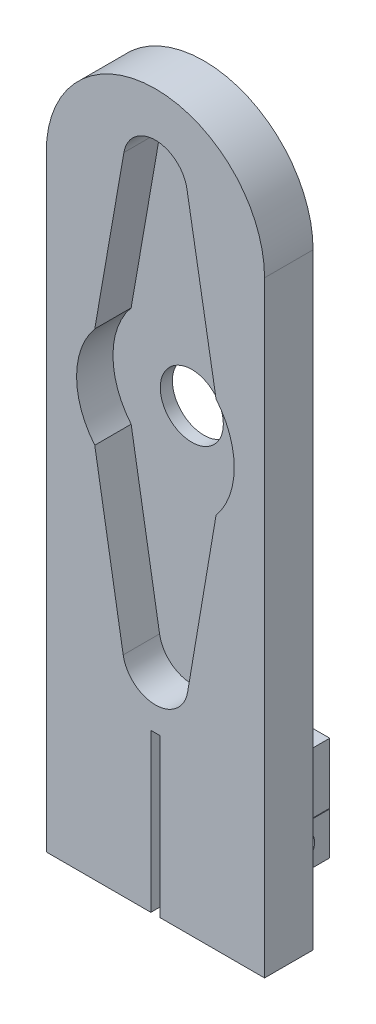
ISO-10303-21;
HEADER;
FILE_DESCRIPTION(('STEP AP214'),'2;1');
FILE_NAME('part.step','',(''),(''),'','','');
FILE_SCHEMA(('AUTOMOTIVE_DESIGN { 1 0 10303 214 1 1 1 1 }'));
ENDSEC;
DATA;
#1=APPLICATION_CONTEXT('core data for automotive mechanical design processes');
#2=APPLICATION_PROTOCOL_DEFINITION('international standard','automotive_design',2000,#1);
#3=PRODUCT_CONTEXT('',#1,'mechanical');
#4=PRODUCT('Part','Part','',(#3));
#5=PRODUCT_RELATED_PRODUCT_CATEGORY('part','',(#4));
#6=PRODUCT_DEFINITION_FORMATION('','',#4);
#7=PRODUCT_DEFINITION_CONTEXT('part definition',#1,'design');
#8=PRODUCT_DEFINITION('design','',#6,#7);
#9=PRODUCT_DEFINITION_SHAPE('','',#8);
#10=(LENGTH_UNIT() NAMED_UNIT(*) SI_UNIT(.MILLI.,.METRE.));
#11=(NAMED_UNIT(*) PLANE_ANGLE_UNIT() SI_UNIT($,.RADIAN.));
#12=(NAMED_UNIT(*) SI_UNIT($,.STERADIAN.) SOLID_ANGLE_UNIT());
#13=UNCERTAINTY_MEASURE_WITH_UNIT(LENGTH_MEASURE(1.E-05),#10,'distance_accuracy_value','');
#14=(GEOMETRIC_REPRESENTATION_CONTEXT(3) GLOBAL_UNCERTAINTY_ASSIGNED_CONTEXT((#13)) GLOBAL_UNIT_ASSIGNED_CONTEXT((#10,
#11,#12)) REPRESENTATION_CONTEXT('',''));
#15=CARTESIAN_POINT('',(0.,0.,0.));
#16=DIRECTION('',(0.,0.,1.));
#17=DIRECTION('',(1.,0.,0.));
#18=AXIS2_PLACEMENT_3D('',#15,#16,#17);
#19=CARTESIAN_POINT('',(0.,50.,0.));
#20=DIRECTION('',(0.,0.,-1.));
#21=DIRECTION('',(-1.,0.,0.));
#22=AXIS2_PLACEMENT_3D('',#19,#20,#21);
#23=PLANE('',#22);
#24=CARTESIAN_POINT('',(0.,34.8563142161993,0.));
#25=DIRECTION('',(0.,0.,-1.));
#26=DIRECTION('',(-1.,0.,0.));
#27=AXIS2_PLACEMENT_3D('',#24,#25,#26);
#28=CIRCLE('',#27,2.6);
#29=CARTESIAN_POINT('',(-2.6,34.8563142161993,0.));
#30=VERTEX_POINT('',#29);
#31=EDGE_CURVE('E335',#30,#30,#28,.F.);
#32=ORIENTED_EDGE('',*,*,#31,.T.);
#33=EDGE_LOOP('',(#32));
#34=FACE_BOUND('',#33,.T.);
#35=DIRECTION('',(0.,1.,0.));
#36=VECTOR('',#35,1.);
#37=CARTESIAN_POINT('',(0.375,0.,0.));
#38=LINE('',#37,#36);
#39=CARTESIAN_POINT('',(0.375,0.,0.));
#40=VERTEX_POINT('',#39);
#41=CARTESIAN_POINT('',(0.375,2.2621640661949,0.));
#42=VERTEX_POINT('',#41);
#43=EDGE_CURVE('E310',#40,#42,#38,.T.);
#44=ORIENTED_EDGE('',*,*,#43,.T.);
#45=DIRECTION('',(-1.,0.,0.));
#46=VECTOR('',#45,1.);
#47=CARTESIAN_POINT('',(5.375,2.2621640661949,0.));
#48=LINE('',#47,#46);
#49=CARTESIAN_POINT('',(5.375,2.2621640661949,0.));
#50=VERTEX_POINT('',#49);
#51=EDGE_CURVE('E59',#50,#42,#48,.T.);
#52=ORIENTED_EDGE('',*,*,#51,.F.);
#53=DIRECTION('',(0.,-1.,0.));
#54=VECTOR('',#53,1.);
#55=CARTESIAN_POINT('',(5.375,5.7621640661949,0.));
#56=LINE('',#55,#54);
#57=CARTESIAN_POINT('',(5.375,5.7621640661949,0.));
#58=VERTEX_POINT('',#57);
#59=EDGE_CURVE('E64',#58,#50,#56,.T.);
#60=ORIENTED_EDGE('',*,*,#59,.F.);
#61=DIRECTION('',(-1.,0.,0.));
#62=VECTOR('',#61,1.);
#63=CARTESIAN_POINT('',(5.375,5.7621640661949,0.));
#64=LINE('',#63,#62);
#65=CARTESIAN_POINT('',(0.375,5.7621640661949,0.));
#66=VERTEX_POINT('',#65);
#67=EDGE_CURVE('E230',#58,#66,#64,.T.);
#68=ORIENTED_EDGE('',*,*,#67,.T.);
#69=CARTESIAN_POINT('',(0.375,5.81216406619489,0.));
#70=VERTEX_POINT('',#69);
#71=EDGE_CURVE('E314',#66,#70,#38,.T.);
#72=ORIENTED_EDGE('',*,*,#71,.T.);
#73=DIRECTION('',(1.,0.,0.));
#74=VECTOR('',#73,1.);
#75=CARTESIAN_POINT('',(5.375,5.8121640661949,0.));
#76=LINE('',#75,#74);
#77=CARTESIAN_POINT('',(5.375,5.8121640661949,0.));
#78=VERTEX_POINT('',#77);
#79=EDGE_CURVE('E260',#70,#78,#76,.T.);
#80=ORIENTED_EDGE('',*,*,#79,.T.);
#81=DIRECTION('',(0.,1.,0.));
#82=VECTOR('',#81,1.);
#83=CARTESIAN_POINT('',(5.375,10.8121640661949,0.));
#84=LINE('',#83,#82);
#85=CARTESIAN_POINT('',(5.375,10.8121640661949,0.));
#86=VERTEX_POINT('',#85);
#87=EDGE_CURVE('E254',#78,#86,#84,.T.);
#88=ORIENTED_EDGE('',*,*,#87,.T.);
#89=DIRECTION('',(-1.,0.,0.));
#90=VECTOR('',#89,1.);
#91=CARTESIAN_POINT('',(5.375,10.8121640661949,0.));
#92=LINE('',#91,#90);
#93=CARTESIAN_POINT('',(0.375,10.8121640661949,0.));
#94=VERTEX_POINT('',#93);
#95=EDGE_CURVE('E276',#86,#94,#92,.T.);
#96=ORIENTED_EDGE('',*,*,#95,.T.);
#97=CARTESIAN_POINT('',(0.375,13.,0.));
#98=VERTEX_POINT('',#97);
#99=EDGE_CURVE('E287',#94,#98,#38,.T.);
#100=ORIENTED_EDGE('',*,*,#99,.T.);
#101=DIRECTION('',(1.,0.,0.));
#102=VECTOR('',#101,1.);
#103=CARTESIAN_POINT('',(-0.375,13.,0.));
#104=LINE('',#103,#102);
#105=CARTESIAN_POINT('',(-0.375,13.,0.));
#106=VERTEX_POINT('',#105);
#107=EDGE_CURVE('E313',#106,#98,#104,.T.);
#108=ORIENTED_EDGE('',*,*,#107,.F.);
#109=DIRECTION('',(0.,1.,0.));
#110=VECTOR('',#109,1.);
#111=CARTESIAN_POINT('',(-0.375,0.,0.));
#112=LINE('',#111,#110);
#113=CARTESIAN_POINT('',(-0.375,0.,0.));
#114=VERTEX_POINT('',#113);
#115=EDGE_CURVE('E301',#114,#106,#112,.T.);
#116=ORIENTED_EDGE('',*,*,#115,.F.);
#117=DIRECTION('',(1.,0.,0.));
#118=VECTOR('',#117,1.);
#119=CARTESIAN_POINT('',(-9.,0.,0.));
#120=LINE('',#119,#118);
#121=CARTESIAN_POINT('',(-9.,0.,0.));
#122=VERTEX_POINT('',#121);
#123=EDGE_CURVE('E443',#122,#114,#120,.T.);
#124=ORIENTED_EDGE('',*,*,#123,.F.);
#125=DIRECTION('',(0.,1.,0.));
#126=VECTOR('',#125,1.);
#127=CARTESIAN_POINT('',(-9.,0.,0.));
#128=LINE('',#127,#126);
#129=CARTESIAN_POINT('',(-8.99999999999999,50.,0.));
#130=VERTEX_POINT('',#129);
#131=EDGE_CURVE('E455',#122,#130,#128,.T.);
#132=ORIENTED_EDGE('',*,*,#131,.T.);
#133=CARTESIAN_POINT('',(0.,50.,0.));
#134=DIRECTION('',(0.,0.,-1.));
#135=DIRECTION('',(-1.,0.,0.));
#136=AXIS2_PLACEMENT_3D('',#133,#134,#135);
#137=CIRCLE('',#136,8.99999999999999);
#138=CARTESIAN_POINT('',(8.99999999999999,50.,0.));
#139=VERTEX_POINT('',#138);
#140=EDGE_CURVE('E451',#130,#139,#137,.T.);
#141=ORIENTED_EDGE('',*,*,#140,.T.);
#142=DIRECTION('',(0.,1.,0.));
#143=VECTOR('',#142,1.);
#144=CARTESIAN_POINT('',(9.,0.,0.));
#145=LINE('',#144,#143);
#146=CARTESIAN_POINT('',(9.,0.,0.));
#147=VERTEX_POINT('',#146);
#148=EDGE_CURVE('E447',#147,#139,#145,.T.);
#149=ORIENTED_EDGE('',*,*,#148,.F.);
#150=EDGE_CURVE('E404',#40,#147,#120,.T.);
#151=ORIENTED_EDGE('',*,*,#150,.F.);
#152=EDGE_LOOP('',(#44,#52,#60,#68,#72,#80,#88,#96,#100,#108,#116,#124,#132,#141,#149,#151));
#153=FACE_BOUND('',#152,.T.);
#154=ADVANCED_FACE('F41',(#34,#153),#23,.T.);
#155=CARTESIAN_POINT('',(-9.,0.,4.));
#156=DIRECTION('',(0.,1.,0.));
#157=DIRECTION('',(0.,0.,1.));
#158=AXIS2_PLACEMENT_3D('',#155,#156,#157);
#159=PLANE('',#158);
#160=DIRECTION('',(0.,0.,-1.));
#161=VECTOR('',#160,1.);
#162=CARTESIAN_POINT('',(0.375,0.,4.));
#163=LINE('',#162,#161);
#164=CARTESIAN_POINT('',(0.375,0.,4.));
#165=VERTEX_POINT('',#164);
#166=EDGE_CURVE('E330',#165,#40,#163,.T.);
#167=ORIENTED_EDGE('',*,*,#166,.T.);
#168=ORIENTED_EDGE('',*,*,#150,.T.);
#169=DIRECTION('',(0.,0.,-1.));
#170=VECTOR('',#169,1.);
#171=CARTESIAN_POINT('',(9.,0.,4.));
#172=LINE('',#171,#170);
#173=CARTESIAN_POINT('',(9.,0.,4.));
#174=VERTEX_POINT('',#173);
#175=EDGE_CURVE('E11',#174,#147,#172,.T.);
#176=ORIENTED_EDGE('',*,*,#175,.F.);
#177=DIRECTION('',(1.,0.,0.));
#178=VECTOR('',#177,1.);
#179=CARTESIAN_POINT('',(-9.,0.,4.));
#180=LINE('',#179,#178);
#181=EDGE_CURVE('E431',#165,#174,#180,.T.);
#182=ORIENTED_EDGE('',*,*,#181,.F.);
#183=EDGE_LOOP('',(#167,#168,#176,#182));
#184=FACE_BOUND('',#183,.T.);
#185=ADVANCED_FACE('F488',(#184),#159,.F.);
#186=CARTESIAN_POINT('',(0.,50.,4.));
#187=DIRECTION('',(0.,0.,-1.));
#188=DIRECTION('',(-1.,0.,0.));
#189=AXIS2_PLACEMENT_3D('',#186,#187,#188);
#190=PLANE('',#189);
#191=DIRECTION('',(0.171428571428572,-0.98519655140381,0.));
#192=VECTOR('',#191,1.);
#193=CARTESIAN_POINT('',(2.6,53.145110573231,4.));
#194=LINE('',#193,#192);
#195=CARTESIAN_POINT('',(2.6,53.145110573231,4.));
#196=VERTEX_POINT('',#195);
#197=CARTESIAN_POINT('',(5.,39.3523588535777,4.));
#198=VERTEX_POINT('',#197);
#199=EDGE_CURVE('E374',#196,#198,#194,.T.);
#200=ORIENTED_EDGE('',*,*,#199,.T.);
#201=CARTESIAN_POINT('',(0.,35.1990469221187,4.));
#202=DIRECTION('',(0.,0.,1.));
#203=DIRECTION('',(1.,0.,0.));
#204=AXIS2_PLACEMENT_3D('',#201,#202,#203);
#205=CIRCLE('',#204,6.5);
#206=CARTESIAN_POINT('',(5.,31.0457349906596,4.));
#207=VERTEX_POINT('',#206);
#208=EDGE_CURVE('E339',#207,#198,#205,.T.);
#209=ORIENTED_EDGE('',*,*,#208,.F.);
#210=DIRECTION('',(-0.167405247280844,-0.985888169714415,0.));
#211=VECTOR('',#210,1.);
#212=CARTESIAN_POINT('',(5.,31.0457349906596,4.));
#213=LINE('',#212,#211);
#214=CARTESIAN_POINT('',(2.65632653806819,17.2433006146578,4.));
#215=VERTEX_POINT('',#214);
#216=EDGE_CURVE('E345',#207,#215,#213,.T.);
#217=ORIENTED_EDGE('',*,*,#216,.T.);
#218=CARTESIAN_POINT('',(0.,17.6943487300772,4.));
#219=DIRECTION('',(0.,0.,1.));
#220=DIRECTION('',(1.,0.,0.));
#221=AXIS2_PLACEMENT_3D('',#218,#219,#220);
#222=CIRCLE('',#221,2.69434873007722);
#223=CARTESIAN_POINT('',(-2.65632653806819,17.2433006146578,4.));
#224=VERTEX_POINT('',#223);
#225=EDGE_CURVE('E394',#224,#215,#222,.T.);
#226=ORIENTED_EDGE('',*,*,#225,.F.);
#227=DIRECTION('',(0.167405247280844,-0.985888169714415,0.));
#228=VECTOR('',#227,1.);
#229=CARTESIAN_POINT('',(-5.,31.0457349906596,4.));
#230=LINE('',#229,#228);
#231=CARTESIAN_POINT('',(-5.,31.0457349906596,4.));
#232=VERTEX_POINT('',#231);
#233=EDGE_CURVE('E390',#232,#224,#230,.T.);
#234=ORIENTED_EDGE('',*,*,#233,.F.);
#235=CARTESIAN_POINT('',(0.,35.1990469221187,4.));
#236=DIRECTION('',(0.,0.,1.));
#237=DIRECTION('',(1.,0.,0.));
#238=AXIS2_PLACEMENT_3D('',#235,#236,#237);
#239=CIRCLE('',#238,6.5);
#240=CARTESIAN_POINT('',(-5.00000000000001,39.3523588535777,4.));
#241=VERTEX_POINT('',#240);
#242=EDGE_CURVE('E386',#241,#232,#239,.T.);
#243=ORIENTED_EDGE('',*,*,#242,.F.);
#244=DIRECTION('',(-0.171428571428572,-0.98519655140381,0.));
#245=VECTOR('',#244,1.);
#246=CARTESIAN_POINT('',(-2.6,53.145110573231,4.));
#247=LINE('',#246,#245);
#248=CARTESIAN_POINT('',(-2.6,53.145110573231,4.));
#249=VERTEX_POINT('',#248);
#250=EDGE_CURVE('E382',#249,#241,#247,.T.);
#251=ORIENTED_EDGE('',*,*,#250,.F.);
#252=CARTESIAN_POINT('',(0.,52.6926990365898,4.));
#253=DIRECTION('',(0.,0.,1.));
#254=DIRECTION('',(1.,0.,0.));
#255=AXIS2_PLACEMENT_3D('',#252,#253,#254);
#256=CIRCLE('',#255,2.63906729707413);
#257=EDGE_CURVE('E378',#196,#249,#256,.T.);
#258=ORIENTED_EDGE('',*,*,#257,.F.);
#259=EDGE_LOOP('',(#200,#209,#217,#226,#234,#243,#251,#258));
#260=FACE_BOUND('',#259,.T.);
#261=DIRECTION('',(0.,1.,0.));
#262=VECTOR('',#261,1.);
#263=CARTESIAN_POINT('',(0.375,0.,4.));
#264=LINE('',#263,#262);
#265=CARTESIAN_POINT('',(0.375,13.,4.));
#266=VERTEX_POINT('',#265);
#267=EDGE_CURVE('E297',#165,#266,#264,.T.);
#268=ORIENTED_EDGE('',*,*,#267,.F.);
#269=ORIENTED_EDGE('',*,*,#181,.T.);
#270=DIRECTION('',(0.,1.,0.));
#271=VECTOR('',#270,1.);
#272=CARTESIAN_POINT('',(9.,0.,4.));
#273=LINE('',#272,#271);
#274=CARTESIAN_POINT('',(8.99999999999999,50.,4.));
#275=VERTEX_POINT('',#274);
#276=EDGE_CURVE('E430',#174,#275,#273,.T.);
#277=ORIENTED_EDGE('',*,*,#276,.T.);
#278=CARTESIAN_POINT('',(0.,50.,4.));
#279=DIRECTION('',(0.,0.,-1.));
#280=DIRECTION('',(-1.,0.,0.));
#281=AXIS2_PLACEMENT_3D('',#278,#279,#280);
#282=CIRCLE('',#281,8.99999999999999);
#283=CARTESIAN_POINT('',(-8.99999999999999,50.,4.));
#284=VERTEX_POINT('',#283);
#285=EDGE_CURVE('E434',#284,#275,#282,.T.);
#286=ORIENTED_EDGE('',*,*,#285,.F.);
#287=DIRECTION('',(0.,1.,0.));
#288=VECTOR('',#287,1.);
#289=CARTESIAN_POINT('',(-9.,0.,4.));
#290=LINE('',#289,#288);
#291=CARTESIAN_POINT('',(-9.,0.,4.));
#292=VERTEX_POINT('',#291);
#293=EDGE_CURVE('E438',#292,#284,#290,.T.);
#294=ORIENTED_EDGE('',*,*,#293,.F.);
#295=CARTESIAN_POINT('',(-0.375,0.,4.));
#296=VERTEX_POINT('',#295);
#297=EDGE_CURVE('E426',#292,#296,#180,.T.);
#298=ORIENTED_EDGE('',*,*,#297,.T.);
#299=DIRECTION('',(0.,1.,0.));
#300=VECTOR('',#299,1.);
#301=CARTESIAN_POINT('',(-0.375,0.,4.));
#302=LINE('',#301,#300);
#303=CARTESIAN_POINT('',(-0.375,13.,4.));
#304=VERTEX_POINT('',#303);
#305=EDGE_CURVE('E305',#296,#304,#302,.T.);
#306=ORIENTED_EDGE('',*,*,#305,.T.);
#307=DIRECTION('',(1.,0.,0.));
#308=VECTOR('',#307,1.);
#309=CARTESIAN_POINT('',(-0.375,13.,4.));
#310=LINE('',#309,#308);
#311=EDGE_CURVE('E300',#304,#266,#310,.T.);
#312=ORIENTED_EDGE('',*,*,#311,.T.);
#313=EDGE_LOOP('',(#268,#269,#277,#286,#294,#298,#306,#312));
#314=FACE_BOUND('',#313,.T.);
#315=ADVANCED_FACE('F494',(#260,#314),#190,.F.);
#316=ORIENTED_EDGE('',*,*,#123,.T.);
#317=DIRECTION('',(0.,0.,-1.));
#318=VECTOR('',#317,1.);
#319=CARTESIAN_POINT('',(-0.375,0.,4.));
#320=LINE('',#319,#318);
#321=EDGE_CURVE('E309',#296,#114,#320,.T.);
#322=ORIENTED_EDGE('',*,*,#321,.F.);
#323=ORIENTED_EDGE('',*,*,#297,.F.);
#324=DIRECTION('',(0.,0.,-1.));
#325=VECTOR('',#324,1.);
#326=CARTESIAN_POINT('',(-9.,0.,4.));
#327=LINE('',#326,#325);
#328=EDGE_CURVE('E442',#292,#122,#327,.T.);
#329=ORIENTED_EDGE('',*,*,#328,.T.);
#330=EDGE_LOOP('',(#316,#322,#323,#329));
#331=FACE_BOUND('',#330,.T.);
#332=ADVANCED_FACE('F43',(#331),#159,.F.);
#333=CARTESIAN_POINT('',(9.,0.,4.));
#334=DIRECTION('',(-1.,0.,0.));
#335=DIRECTION('',(0.,-1.,0.));
#336=AXIS2_PLACEMENT_3D('',#333,#334,#335);
#337=PLANE('',#336);
#338=ORIENTED_EDGE('',*,*,#148,.T.);
#339=DIRECTION('',(0.,0.,-1.));
#340=VECTOR('',#339,1.);
#341=CARTESIAN_POINT('',(8.99999999999999,50.,4.));
#342=LINE('',#341,#340);
#343=EDGE_CURVE('E51',#275,#139,#342,.T.);
#344=ORIENTED_EDGE('',*,*,#343,.F.);
#345=ORIENTED_EDGE('',*,*,#276,.F.);
#346=ORIENTED_EDGE('',*,*,#175,.T.);
#347=EDGE_LOOP('',(#338,#344,#345,#346));
#348=FACE_BOUND('',#347,.T.);
#349=ADVANCED_FACE('F506',(#348),#337,.F.);
#350=CARTESIAN_POINT('',(0.,50.,4.));
#351=DIRECTION('',(0.,0.,-1.));
#352=DIRECTION('',(-1.,0.,0.));
#353=AXIS2_PLACEMENT_3D('',#350,#351,#352);
#354=CYLINDRICAL_SURFACE('',#353,8.99999999999999);
#355=ORIENTED_EDGE('',*,*,#140,.F.);
#356=DIRECTION('',(0.,0.,-1.));
#357=VECTOR('',#356,1.);
#358=CARTESIAN_POINT('',(-8.99999999999999,50.,4.));
#359=LINE('',#358,#357);
#360=EDGE_CURVE('E461',#284,#130,#359,.T.);
#361=ORIENTED_EDGE('',*,*,#360,.F.);
#362=ORIENTED_EDGE('',*,*,#285,.T.);
#363=ORIENTED_EDGE('',*,*,#343,.T.);
#364=EDGE_LOOP('',(#355,#361,#362,#363));
#365=FACE_BOUND('',#364,.T.);
#366=ADVANCED_FACE('F503',(#365),#354,.T.);
#367=CARTESIAN_POINT('',(-9.,0.,4.));
#368=DIRECTION('',(-1.,0.,0.));
#369=DIRECTION('',(0.,-1.,0.));
#370=AXIS2_PLACEMENT_3D('',#367,#368,#369);
#371=PLANE('',#370);
#372=ORIENTED_EDGE('',*,*,#131,.F.);
#373=ORIENTED_EDGE('',*,*,#328,.F.);
#374=ORIENTED_EDGE('',*,*,#293,.T.);
#375=ORIENTED_EDGE('',*,*,#360,.T.);
#376=EDGE_LOOP('',(#372,#373,#374,#375));
#377=FACE_BOUND('',#376,.T.);
#378=ADVANCED_FACE('F499',(#377),#371,.T.);
#379=CARTESIAN_POINT('',(0.,35.1990469221187,1.));
#380=DIRECTION('',(0.,0.,1.));
#381=DIRECTION('',(1.,0.,0.));
#382=AXIS2_PLACEMENT_3D('',#379,#380,#381);
#383=CYLINDRICAL_SURFACE('',#382,6.5);
#384=ORIENTED_EDGE('',*,*,#208,.T.);
#385=DIRECTION('',(0.,0.,1.));
#386=VECTOR('',#385,1.);
#387=CARTESIAN_POINT('',(5.,39.3523588535777,1.));
#388=LINE('',#387,#386);
#389=CARTESIAN_POINT('',(5.,39.3523588535777,1.));
#390=VERTEX_POINT('',#389);
#391=EDGE_CURVE('E371',#390,#198,#388,.T.);
#392=ORIENTED_EDGE('',*,*,#391,.F.);
#393=CARTESIAN_POINT('',(0.,35.1990469221187,1.));
#394=DIRECTION('',(0.,0.,1.));
#395=DIRECTION('',(1.,0.,0.));
#396=AXIS2_PLACEMENT_3D('',#393,#394,#395);
#397=CIRCLE('',#396,6.5);
#398=CARTESIAN_POINT('',(5.,31.0457349906596,1.));
#399=VERTEX_POINT('',#398);
#400=EDGE_CURVE('E340',#399,#390,#397,.T.);
#401=ORIENTED_EDGE('',*,*,#400,.F.);
#402=DIRECTION('',(0.,0.,1.));
#403=VECTOR('',#402,1.);
#404=CARTESIAN_POINT('',(5.,31.0457349906596,1.));
#405=LINE('',#404,#403);
#406=EDGE_CURVE('E401',#399,#207,#405,.T.);
#407=ORIENTED_EDGE('',*,*,#406,.T.);
#408=EDGE_LOOP('',(#384,#392,#401,#407));
#409=FACE_BOUND('',#408,.T.);
#410=ADVANCED_FACE('F502',(#409),#383,.F.);
#411=CARTESIAN_POINT('',(5.,31.0457349906596,1.));
#412=DIRECTION('',(-0.985888169714415,0.167405247280844,0.));
#413=DIRECTION('',(-0.167405247280844,-0.985888169714415,0.));
#414=AXIS2_PLACEMENT_3D('',#411,#412,#413);
#415=PLANE('',#414);
#416=ORIENTED_EDGE('',*,*,#216,.F.);
#417=ORIENTED_EDGE('',*,*,#406,.F.);
#418=DIRECTION('',(-0.167405247280844,-0.985888169714415,0.));
#419=VECTOR('',#418,1.);
#420=CARTESIAN_POINT('',(5.,31.0457349906596,1.));
#421=LINE('',#420,#419);
#422=CARTESIAN_POINT('',(2.65632653806819,17.2433006146578,1.));
#423=VERTEX_POINT('',#422);
#424=EDGE_CURVE('E368',#399,#423,#421,.T.);
#425=ORIENTED_EDGE('',*,*,#424,.T.);
#426=DIRECTION('',(0.,0.,1.));
#427=VECTOR('',#426,1.);
#428=CARTESIAN_POINT('',(2.65632653806819,17.2433006146578,1.));
#429=LINE('',#428,#427);
#430=EDGE_CURVE('E405',#423,#215,#429,.T.);
#431=ORIENTED_EDGE('',*,*,#430,.T.);
#432=EDGE_LOOP('',(#416,#417,#425,#431));
#433=FACE_BOUND('',#432,.T.);
#434=ADVANCED_FACE('F767',(#433),#415,.T.);
#435=CARTESIAN_POINT('',(0.,17.6943487300772,1.));
#436=DIRECTION('',(0.,0.,1.));
#437=DIRECTION('',(1.,0.,0.));
#438=AXIS2_PLACEMENT_3D('',#435,#436,#437);
#439=CYLINDRICAL_SURFACE('',#438,2.69434873007722);
#440=ORIENTED_EDGE('',*,*,#225,.T.);
#441=ORIENTED_EDGE('',*,*,#430,.F.);
#442=CARTESIAN_POINT('',(0.,17.6943487300772,1.));
#443=DIRECTION('',(0.,0.,1.));
#444=DIRECTION('',(1.,0.,0.));
#445=AXIS2_PLACEMENT_3D('',#442,#443,#444);
#446=CIRCLE('',#445,2.69434873007722);
#447=CARTESIAN_POINT('',(-2.65632653806819,17.2433006146578,1.));
#448=VERTEX_POINT('',#447);
#449=EDGE_CURVE('E364',#448,#423,#446,.T.);
#450=ORIENTED_EDGE('',*,*,#449,.F.);
#451=DIRECTION('',(0.,0.,1.));
#452=VECTOR('',#451,1.);
#453=CARTESIAN_POINT('',(-2.65632653806819,17.2433006146578,1.));
#454=LINE('',#453,#452);
#455=EDGE_CURVE('E408',#448,#224,#454,.T.);
#456=ORIENTED_EDGE('',*,*,#455,.T.);
#457=EDGE_LOOP('',(#440,#441,#450,#456));
#458=FACE_BOUND('',#457,.T.);
#459=ADVANCED_FACE('F758',(#458),#439,.F.);
#460=CARTESIAN_POINT('',(-5.,31.0457349906596,1.));
#461=DIRECTION('',(-0.985888169714415,-0.167405247280844,0.));
#462=DIRECTION('',(0.167405247280844,-0.985888169714415,0.));
#463=AXIS2_PLACEMENT_3D('',#460,#461,#462);
#464=PLANE('',#463);
#465=ORIENTED_EDGE('',*,*,#233,.T.);
#466=ORIENTED_EDGE('',*,*,#455,.F.);
#467=DIRECTION('',(0.167405247280844,-0.985888169714415,0.));
#468=VECTOR('',#467,1.);
#469=CARTESIAN_POINT('',(-5.,31.0457349906596,1.));
#470=LINE('',#469,#468);
#471=CARTESIAN_POINT('',(-5.,31.0457349906596,1.));
#472=VERTEX_POINT('',#471);
#473=EDGE_CURVE('E360',#472,#448,#470,.T.);
#474=ORIENTED_EDGE('',*,*,#473,.F.);
#475=DIRECTION('',(0.,0.,1.));
#476=VECTOR('',#475,1.);
#477=CARTESIAN_POINT('',(-5.,31.0457349906596,1.));
#478=LINE('',#477,#476);
#479=EDGE_CURVE('E411',#472,#232,#478,.T.);
#480=ORIENTED_EDGE('',*,*,#479,.T.);
#481=EDGE_LOOP('',(#465,#466,#474,#480));
#482=FACE_BOUND('',#481,.T.);
#483=ADVANCED_FACE('F749',(#482),#464,.F.);
#484=CARTESIAN_POINT('',(0.,35.1990469221187,1.));
#485=DIRECTION('',(0.,0.,1.));
#486=DIRECTION('',(1.,0.,0.));
#487=AXIS2_PLACEMENT_3D('',#484,#485,#486);
#488=CYLINDRICAL_SURFACE('',#487,6.5);
#489=ORIENTED_EDGE('',*,*,#242,.T.);
#490=ORIENTED_EDGE('',*,*,#479,.F.);
#491=CARTESIAN_POINT('',(0.,35.1990469221187,1.));
#492=DIRECTION('',(0.,0.,1.));
#493=DIRECTION('',(1.,0.,0.));
#494=AXIS2_PLACEMENT_3D('',#491,#492,#493);
#495=CIRCLE('',#494,6.5);
#496=CARTESIAN_POINT('',(-5.00000000000001,39.3523588535777,1.));
#497=VERTEX_POINT('',#496);
#498=EDGE_CURVE('E356',#497,#472,#495,.T.);
#499=ORIENTED_EDGE('',*,*,#498,.F.);
#500=DIRECTION('',(0.,0.,1.));
#501=VECTOR('',#500,1.);
#502=CARTESIAN_POINT('',(-5.00000000000001,39.3523588535777,1.));
#503=LINE('',#502,#501);
#504=EDGE_CURVE('E414',#497,#241,#503,.T.);
#505=ORIENTED_EDGE('',*,*,#504,.T.);
#506=EDGE_LOOP('',(#489,#490,#499,#505));
#507=FACE_BOUND('',#506,.T.);
#508=ADVANCED_FACE('F740',(#507),#488,.F.);
#509=CARTESIAN_POINT('',(-2.6,53.145110573231,1.));
#510=DIRECTION('',(-0.985196551403809,0.171428571428572,0.));
#511=DIRECTION('',(-0.171428571428572,-0.98519655140381,0.));
#512=AXIS2_PLACEMENT_3D('',#509,#510,#511);
#513=PLANE('',#512);
#514=ORIENTED_EDGE('',*,*,#250,.T.);
#515=ORIENTED_EDGE('',*,*,#504,.F.);
#516=DIRECTION('',(-0.171428571428572,-0.98519655140381,0.));
#517=VECTOR('',#516,1.);
#518=CARTESIAN_POINT('',(-2.6,53.145110573231,1.));
#519=LINE('',#518,#517);
#520=CARTESIAN_POINT('',(-2.6,53.145110573231,1.));
#521=VERTEX_POINT('',#520);
#522=EDGE_CURVE('E352',#521,#497,#519,.T.);
#523=ORIENTED_EDGE('',*,*,#522,.F.);
#524=DIRECTION('',(0.,0.,1.));
#525=VECTOR('',#524,1.);
#526=CARTESIAN_POINT('',(-2.6,53.145110573231,1.));
#527=LINE('',#526,#525);
#528=EDGE_CURVE('E417',#521,#249,#527,.T.);
#529=ORIENTED_EDGE('',*,*,#528,.T.);
#530=EDGE_LOOP('',(#514,#515,#523,#529));
#531=FACE_BOUND('',#530,.T.);
#532=ADVANCED_FACE('F731',(#531),#513,.F.);
#533=CARTESIAN_POINT('',(0.,52.6926990365898,1.));
#534=DIRECTION('',(0.,0.,1.));
#535=DIRECTION('',(1.,0.,0.));
#536=AXIS2_PLACEMENT_3D('',#533,#534,#535);
#537=CYLINDRICAL_SURFACE('',#536,2.63906729707413);
#538=ORIENTED_EDGE('',*,*,#257,.T.);
#539=ORIENTED_EDGE('',*,*,#528,.F.);
#540=CARTESIAN_POINT('',(0.,52.6926990365898,1.));
#541=DIRECTION('',(0.,0.,1.));
#542=DIRECTION('',(1.,0.,0.));
#543=AXIS2_PLACEMENT_3D('',#540,#541,#542);
#544=CIRCLE('',#543,2.63906729707413);
#545=CARTESIAN_POINT('',(2.6,53.145110573231,1.));
#546=VERTEX_POINT('',#545);
#547=EDGE_CURVE('E348',#546,#521,#544,.T.);
#548=ORIENTED_EDGE('',*,*,#547,.F.);
#549=DIRECTION('',(0.,0.,1.));
#550=VECTOR('',#549,1.);
#551=CARTESIAN_POINT('',(2.6,53.145110573231,1.));
#552=LINE('',#551,#550);
#553=EDGE_CURVE('E420',#546,#196,#552,.T.);
#554=ORIENTED_EDGE('',*,*,#553,.T.);
#555=EDGE_LOOP('',(#538,#539,#548,#554));
#556=FACE_BOUND('',#555,.T.);
#557=ADVANCED_FACE('F722',(#556),#537,.F.);
#558=CARTESIAN_POINT('',(2.6,53.145110573231,1.));
#559=DIRECTION('',(-0.985196551403809,-0.171428571428572,0.));
#560=DIRECTION('',(0.171428571428572,-0.98519655140381,0.));
#561=AXIS2_PLACEMENT_3D('',#558,#559,#560);
#562=PLANE('',#561);
#563=ORIENTED_EDGE('',*,*,#199,.F.);
#564=ORIENTED_EDGE('',*,*,#553,.F.);
#565=DIRECTION('',(0.171428571428572,-0.98519655140381,0.));
#566=VECTOR('',#565,1.);
#567=CARTESIAN_POINT('',(2.6,53.145110573231,1.));
#568=LINE('',#567,#566);
#569=EDGE_CURVE('E344',#546,#390,#568,.T.);
#570=ORIENTED_EDGE('',*,*,#569,.T.);
#571=ORIENTED_EDGE('',*,*,#391,.T.);
#572=EDGE_LOOP('',(#563,#564,#570,#571));
#573=FACE_BOUND('',#572,.T.);
#574=ADVANCED_FACE('F484',(#573),#562,.T.);
#575=CARTESIAN_POINT('',(0.,35.1990469221187,1.));
#576=DIRECTION('',(0.,0.,1.));
#577=DIRECTION('',(1.,0.,0.));
#578=AXIS2_PLACEMENT_3D('',#575,#576,#577);
#579=PLANE('',#578);
#580=CARTESIAN_POINT('',(0.,34.8563142161993,1.));
#581=DIRECTION('',(0.,0.,1.));
#582=DIRECTION('',(1.,0.,0.));
#583=AXIS2_PLACEMENT_3D('',#580,#581,#582);
#584=CIRCLE('',#583,2.6);
#585=CARTESIAN_POINT('',(2.6,34.8563142161993,1.));
#586=VERTEX_POINT('',#585);
#587=EDGE_CURVE('E334',#586,#586,#584,.F.);
#588=ORIENTED_EDGE('',*,*,#587,.T.);
#589=EDGE_LOOP('',(#588));
#590=FACE_BOUND('',#589,.T.);
#591=ORIENTED_EDGE('',*,*,#400,.T.);
#592=ORIENTED_EDGE('',*,*,#569,.F.);
#593=ORIENTED_EDGE('',*,*,#547,.T.);
#594=ORIENTED_EDGE('',*,*,#522,.T.);
#595=ORIENTED_EDGE('',*,*,#498,.T.);
#596=ORIENTED_EDGE('',*,*,#473,.T.);
#597=ORIENTED_EDGE('',*,*,#449,.T.);
#598=ORIENTED_EDGE('',*,*,#424,.F.);
#599=EDGE_LOOP('',(#591,#592,#593,#594,#595,#596,#597,#598));
#600=FACE_BOUND('',#599,.T.);
#601=ADVANCED_FACE('F469',(#590,#600),#579,.T.);
#602=CARTESIAN_POINT('',(0.,34.8563142161993,19.));
#603=DIRECTION('',(0.,0.,-1.));
#604=DIRECTION('',(-1.,0.,0.));
#605=AXIS2_PLACEMENT_3D('',#602,#603,#604);
#606=CYLINDRICAL_SURFACE('',#605,2.6);
#607=ORIENTED_EDGE('',*,*,#31,.F.);
#608=EDGE_LOOP('',(#607));
#609=FACE_BOUND('',#608,.T.);
#610=ORIENTED_EDGE('',*,*,#587,.F.);
#611=EDGE_LOOP('',(#610));
#612=FACE_BOUND('',#611,.T.);
#613=ADVANCED_FACE('F472',(#609,#612),#606,.F.);
#614=CARTESIAN_POINT('',(0.375,0.,4.));
#615=DIRECTION('',(-1.,0.,0.));
#616=DIRECTION('',(0.,0.,1.));
#617=AXIS2_PLACEMENT_3D('',#614,#615,#616);
#618=PLANE('',#617);
#619=CARTESIAN_POINT('',(0.375,8.3121640661949,-2.37977475634449));
#620=DIRECTION('',(-1.,0.,0.));
#621=DIRECTION('',(0.,0.,1.));
#622=AXIS2_PLACEMENT_3D('',#619,#620,#621);
#623=CIRCLE('',#622,1.25);
#624=CARTESIAN_POINT('',(0.375,8.3121640661949,-1.12977475634449));
#625=VERTEX_POINT('',#624);
#626=EDGE_CURVE('E250',#625,#625,#623,.F.);
#627=ORIENTED_EDGE('',*,*,#626,.T.);
#628=EDGE_LOOP('',(#627));
#629=FACE_BOUND('',#628,.T.);
#630=ORIENTED_EDGE('',*,*,#43,.F.);
#631=ORIENTED_EDGE('',*,*,#166,.F.);
#632=ORIENTED_EDGE('',*,*,#267,.T.);
#633=DIRECTION('',(0.,0.,-1.));
#634=VECTOR('',#633,1.);
#635=CARTESIAN_POINT('',(0.375,13.,4.));
#636=LINE('',#635,#634);
#637=EDGE_CURVE('E326',#266,#98,#636,.T.);
#638=ORIENTED_EDGE('',*,*,#637,.T.);
#639=ORIENTED_EDGE('',*,*,#99,.F.);
#640=DIRECTION('',(0.,0.,1.));
#641=VECTOR('',#640,1.);
#642=CARTESIAN_POINT('',(0.375,10.8121640661949,-5.));
#643=LINE('',#642,#641);
#644=CARTESIAN_POINT('',(0.375,10.8121640661949,-5.));
#645=VERTEX_POINT('',#644);
#646=EDGE_CURVE('E292',#645,#94,#643,.T.);
#647=ORIENTED_EDGE('',*,*,#646,.F.);
#648=DIRECTION('',(0.,-1.,0.));
#649=VECTOR('',#648,1.);
#650=CARTESIAN_POINT('',(0.375,10.8121640661949,-5.));
#651=LINE('',#650,#649);
#652=CARTESIAN_POINT('',(0.375,5.81216406619489,-5.));
#653=VERTEX_POINT('',#652);
#654=EDGE_CURVE('E264',#645,#653,#651,.T.);
#655=ORIENTED_EDGE('',*,*,#654,.T.);
#656=DIRECTION('',(0.,0.,1.));
#657=VECTOR('',#656,1.);
#658=CARTESIAN_POINT('',(0.375,5.81216406619489,-5.));
#659=LINE('',#658,#657);
#660=EDGE_CURVE('E288',#653,#70,#659,.T.);
#661=ORIENTED_EDGE('',*,*,#660,.T.);
#662=ORIENTED_EDGE('',*,*,#71,.F.);
#663=DIRECTION('',(0.,0.,1.));
#664=VECTOR('',#663,1.);
#665=CARTESIAN_POINT('',(0.375,5.7621640661949,0.));
#666=LINE('',#665,#664);
#667=CARTESIAN_POINT('',(0.375,5.7621640661949,-5.));
#668=VERTEX_POINT('',#667);
#669=EDGE_CURVE('E240',#668,#66,#666,.T.);
#670=ORIENTED_EDGE('',*,*,#669,.F.);
#671=DIRECTION('',(0.,1.,0.));
#672=VECTOR('',#671,1.);
#673=CARTESIAN_POINT('',(0.375,5.7621640661949,-5.));
#674=LINE('',#673,#672);
#675=CARTESIAN_POINT('',(0.375,2.2621640661949,-5.));
#676=VERTEX_POINT('',#675);
#677=EDGE_CURVE('E236',#676,#668,#674,.T.);
#678=ORIENTED_EDGE('',*,*,#677,.F.);
#679=DIRECTION('',(0.,0.,-1.));
#680=VECTOR('',#679,1.);
#681=CARTESIAN_POINT('',(0.375,2.2621640661949,0.));
#682=LINE('',#681,#680);
#683=EDGE_CURVE('E217',#42,#676,#682,.T.);
#684=ORIENTED_EDGE('',*,*,#683,.F.);
#685=EDGE_LOOP('',(#630,#631,#632,#638,#639,#647,#655,#661,#662,#670,#678,#684));
#686=FACE_BOUND('',#685,.T.);
#687=CARTESIAN_POINT('',(0.375,4.0121640661949,-2.5));
#688=DIRECTION('',(1.,0.,0.));
#689=DIRECTION('',(0.,0.,-1.));
#690=AXIS2_PLACEMENT_3D('',#687,#688,#689);
#691=CIRCLE('',#690,1.25);
#692=CARTESIAN_POINT('',(0.375,4.0121640661949,-3.75));
#693=VERTEX_POINT('',#692);
#694=EDGE_CURVE('E679',#693,#693,#691,.T.);
#695=ORIENTED_EDGE('',*,*,#694,.T.);
#696=EDGE_LOOP('',(#695));
#697=FACE_BOUND('',#696,.T.);
#698=ADVANCED_FACE('F474',(#629,#686,#697),#618,.T.);
#699=CARTESIAN_POINT('',(-0.375,13.,4.));
#700=DIRECTION('',(0.,1.,0.));
#701=DIRECTION('',(0.,0.,1.));
#702=AXIS2_PLACEMENT_3D('',#699,#700,#701);
#703=PLANE('',#702);
#704=ORIENTED_EDGE('',*,*,#107,.T.);
#705=ORIENTED_EDGE('',*,*,#637,.F.);
#706=ORIENTED_EDGE('',*,*,#311,.F.);
#707=DIRECTION('',(0.,0.,-1.));
#708=VECTOR('',#707,1.);
#709=CARTESIAN_POINT('',(-0.375,13.,4.));
#710=LINE('',#709,#708);
#711=EDGE_CURVE('E323',#304,#106,#710,.T.);
#712=ORIENTED_EDGE('',*,*,#711,.T.);
#713=EDGE_LOOP('',(#704,#705,#706,#712));
#714=FACE_BOUND('',#713,.T.);
#715=ADVANCED_FACE('F481',(#714),#703,.F.);
#716=CARTESIAN_POINT('',(-0.375,0.,4.));
#717=DIRECTION('',(-1.,0.,0.));
#718=DIRECTION('',(0.,0.,1.));
#719=AXIS2_PLACEMENT_3D('',#716,#717,#718);
#720=PLANE('',#719);
#721=ORIENTED_EDGE('',*,*,#115,.T.);
#722=ORIENTED_EDGE('',*,*,#711,.F.);
#723=ORIENTED_EDGE('',*,*,#305,.F.);
#724=ORIENTED_EDGE('',*,*,#321,.T.);
#725=EDGE_LOOP('',(#721,#722,#723,#724));
#726=FACE_BOUND('',#725,.T.);
#727=ADVANCED_FACE('F530',(#726),#720,.F.);
#728=CARTESIAN_POINT('',(5.375,10.8121640661949,-5.));
#729=DIRECTION('',(1.,0.,0.));
#730=DIRECTION('',(0.,1.,0.));
#731=AXIS2_PLACEMENT_3D('',#728,#729,#730);
#732=PLANE('',#731);
#733=CARTESIAN_POINT('',(5.375,8.3121640661949,-2.37977475634449));
#734=DIRECTION('',(1.,0.,0.));
#735=DIRECTION('',(0.,1.,0.));
#736=AXIS2_PLACEMENT_3D('',#733,#734,#735);
#737=CIRCLE('',#736,1.25);
#738=CARTESIAN_POINT('',(5.375,9.56216406619489,-2.37977475634449));
#739=VERTEX_POINT('',#738);
#740=EDGE_CURVE('E45',#739,#739,#737,.F.);
#741=ORIENTED_EDGE('',*,*,#740,.T.);
#742=EDGE_LOOP('',(#741));
#743=FACE_BOUND('',#742,.T.);
#744=ORIENTED_EDGE('',*,*,#87,.F.);
#745=DIRECTION('',(0.,0.,1.));
#746=VECTOR('',#745,1.);
#747=CARTESIAN_POINT('',(5.375,5.8121640661949,-5.));
#748=LINE('',#747,#746);
#749=CARTESIAN_POINT('',(5.375,5.8121640661949,-5.));
#750=VERTEX_POINT('',#749);
#751=EDGE_CURVE('E283',#750,#78,#748,.T.);
#752=ORIENTED_EDGE('',*,*,#751,.F.);
#753=DIRECTION('',(0.,1.,0.));
#754=VECTOR('',#753,1.);
#755=CARTESIAN_POINT('',(5.375,10.8121640661949,-5.));
#756=LINE('',#755,#754);
#757=CARTESIAN_POINT('',(5.375,10.8121640661949,-5.));
#758=VERTEX_POINT('',#757);
#759=EDGE_CURVE('E255',#750,#758,#756,.T.);
#760=ORIENTED_EDGE('',*,*,#759,.T.);
#761=DIRECTION('',(0.,0.,1.));
#762=VECTOR('',#761,1.);
#763=CARTESIAN_POINT('',(5.375,10.8121640661949,-5.));
#764=LINE('',#763,#762);
#765=EDGE_CURVE('E272',#758,#86,#764,.T.);
#766=ORIENTED_EDGE('',*,*,#765,.T.);
#767=EDGE_LOOP('',(#744,#752,#760,#766));
#768=FACE_BOUND('',#767,.T.);
#769=ADVANCED_FACE('F553',(#743,#768),#732,.T.);
#770=CARTESIAN_POINT('',(5.375,5.8121640661949,-5.));
#771=DIRECTION('',(0.,-1.,0.));
#772=DIRECTION('',(1.,0.,0.));
#773=AXIS2_PLACEMENT_3D('',#770,#771,#772);
#774=PLANE('',#773);
#775=ORIENTED_EDGE('',*,*,#79,.F.);
#776=ORIENTED_EDGE('',*,*,#660,.F.);
#777=DIRECTION('',(1.,0.,0.));
#778=VECTOR('',#777,1.);
#779=CARTESIAN_POINT('',(5.375,5.8121640661949,-5.));
#780=LINE('',#779,#778);
#781=EDGE_CURVE('E268',#653,#750,#780,.T.);
#782=ORIENTED_EDGE('',*,*,#781,.T.);
#783=ORIENTED_EDGE('',*,*,#751,.T.);
#784=EDGE_LOOP('',(#775,#776,#782,#783));
#785=FACE_BOUND('',#784,.T.);
#786=ADVANCED_FACE('F550',(#785),#774,.T.);
#787=CARTESIAN_POINT('',(5.375,10.8121640661949,-5.));
#788=DIRECTION('',(0.,1.,0.));
#789=DIRECTION('',(0.,0.,1.));
#790=AXIS2_PLACEMENT_3D('',#787,#788,#789);
#791=PLANE('',#790);
#792=ORIENTED_EDGE('',*,*,#95,.F.);
#793=ORIENTED_EDGE('',*,*,#765,.F.);
#794=DIRECTION('',(-1.,0.,0.));
#795=VECTOR('',#794,1.);
#796=CARTESIAN_POINT('',(5.375,10.8121640661949,-5.));
#797=LINE('',#796,#795);
#798=EDGE_CURVE('E259',#758,#645,#797,.T.);
#799=ORIENTED_EDGE('',*,*,#798,.T.);
#800=ORIENTED_EDGE('',*,*,#646,.T.);
#801=EDGE_LOOP('',(#792,#793,#799,#800));
#802=FACE_BOUND('',#801,.T.);
#803=ADVANCED_FACE('F559',(#802),#791,.T.);
#804=CARTESIAN_POINT('',(0.,0.,-5.));
#805=DIRECTION('',(0.,0.,-1.));
#806=DIRECTION('',(-1.,0.,0.));
#807=AXIS2_PLACEMENT_3D('',#804,#805,#806);
#808=PLANE('',#807);
#809=ORIENTED_EDGE('',*,*,#759,.F.);
#810=ORIENTED_EDGE('',*,*,#781,.F.);
#811=ORIENTED_EDGE('',*,*,#654,.F.);
#812=ORIENTED_EDGE('',*,*,#798,.F.);
#813=EDGE_LOOP('',(#809,#810,#811,#812));
#814=FACE_BOUND('',#813,.T.);
#815=ADVANCED_FACE('F556',(#814),#808,.T.);
#816=CARTESIAN_POINT('',(39.,8.3121640661949,-2.37977475634449));
#817=DIRECTION('',(-1.,0.,0.));
#818=DIRECTION('',(0.,0.,1.));
#819=AXIS2_PLACEMENT_3D('',#816,#817,#818);
#820=CYLINDRICAL_SURFACE('',#819,1.25);
#821=ORIENTED_EDGE('',*,*,#626,.F.);
#822=EDGE_LOOP('',(#821));
#823=FACE_BOUND('',#822,.T.);
#824=ORIENTED_EDGE('',*,*,#740,.F.);
#825=EDGE_LOOP('',(#824));
#826=FACE_BOUND('',#825,.T.);
#827=ADVANCED_FACE('F566',(#823,#826),#820,.F.);
#828=CARTESIAN_POINT('',(5.375,0.,0.));
#829=DIRECTION('',(1.,0.,0.));
#830=DIRECTION('',(0.,0.,-1.));
#831=AXIS2_PLACEMENT_3D('',#828,#829,#830);
#832=PLANE('',#831);
#833=ORIENTED_EDGE('',*,*,#59,.T.);
#834=DIRECTION('',(0.,0.,-1.));
#835=VECTOR('',#834,1.);
#836=CARTESIAN_POINT('',(5.375,2.2621640661949,0.));
#837=LINE('',#836,#835);
#838=CARTESIAN_POINT('',(5.375,2.2621640661949,-5.));
#839=VERTEX_POINT('',#838);
#840=EDGE_CURVE('E203',#50,#839,#837,.T.);
#841=ORIENTED_EDGE('',*,*,#840,.T.);
#842=DIRECTION('',(0.,1.,0.));
#843=VECTOR('',#842,1.);
#844=CARTESIAN_POINT('',(5.375,5.7621640661949,-5.));
#845=LINE('',#844,#843);
#846=CARTESIAN_POINT('',(5.375,5.7621640661949,-5.));
#847=VERTEX_POINT('',#846);
#848=EDGE_CURVE('E208',#839,#847,#845,.T.);
#849=ORIENTED_EDGE('',*,*,#848,.T.);
#850=DIRECTION('',(0.,0.,1.));
#851=VECTOR('',#850,1.);
#852=CARTESIAN_POINT('',(5.375,5.7621640661949,0.));
#853=LINE('',#852,#851);
#854=EDGE_CURVE('E227',#847,#58,#853,.T.);
#855=ORIENTED_EDGE('',*,*,#854,.T.);
#856=EDGE_LOOP('',(#833,#841,#849,#855));
#857=FACE_BOUND('',#856,.T.);
#858=CARTESIAN_POINT('',(5.375,4.0121640661949,-2.5));
#859=DIRECTION('',(1.,0.,0.));
#860=DIRECTION('',(0.,0.,-1.));
#861=AXIS2_PLACEMENT_3D('',#858,#859,#860);
#862=CIRCLE('',#861,1.25);
#863=CARTESIAN_POINT('',(5.375,4.0121640661949,-3.75));
#864=VERTEX_POINT('',#863);
#865=EDGE_CURVE('E237',#864,#864,#862,.T.);
#866=ORIENTED_EDGE('',*,*,#865,.F.);
#867=EDGE_LOOP('',(#866));
#868=FACE_BOUND('',#867,.T.);
#869=ADVANCED_FACE('F205',(#857,#868),#832,.T.);
#870=CARTESIAN_POINT('',(5.375,2.2621640661949,0.));
#871=DIRECTION('',(0.,1.,0.));
#872=DIRECTION('',(0.,0.,1.));
#873=AXIS2_PLACEMENT_3D('',#870,#871,#872);
#874=PLANE('',#873);
#875=ORIENTED_EDGE('',*,*,#683,.T.);
#876=DIRECTION('',(-1.,0.,0.));
#877=VECTOR('',#876,1.);
#878=CARTESIAN_POINT('',(5.375,2.2621640661949,-5.));
#879=LINE('',#878,#877);
#880=EDGE_CURVE('E214',#839,#676,#879,.T.);
#881=ORIENTED_EDGE('',*,*,#880,.F.);
#882=ORIENTED_EDGE('',*,*,#840,.F.);
#883=ORIENTED_EDGE('',*,*,#51,.T.);
#884=EDGE_LOOP('',(#875,#881,#882,#883));
#885=FACE_BOUND('',#884,.T.);
#886=ADVANCED_FACE('F215',(#885),#874,.F.);
#887=CARTESIAN_POINT('',(5.375,5.7621640661949,-5.));
#888=DIRECTION('',(0.,0.,1.));
#889=DIRECTION('',(0.,-1.,0.));
#890=AXIS2_PLACEMENT_3D('',#887,#888,#889);
#891=PLANE('',#890);
#892=ORIENTED_EDGE('',*,*,#677,.T.);
#893=DIRECTION('',(-1.,0.,0.));
#894=VECTOR('',#893,1.);
#895=CARTESIAN_POINT('',(5.375,5.7621640661949,-5.));
#896=LINE('',#895,#894);
#897=EDGE_CURVE('E221',#847,#668,#896,.T.);
#898=ORIENTED_EDGE('',*,*,#897,.F.);
#899=ORIENTED_EDGE('',*,*,#848,.F.);
#900=ORIENTED_EDGE('',*,*,#880,.T.);
#901=EDGE_LOOP('',(#892,#898,#899,#900));
#902=FACE_BOUND('',#901,.T.);
#903=ADVANCED_FACE('F223',(#902),#891,.F.);
#904=CARTESIAN_POINT('',(5.375,5.7621640661949,0.));
#905=DIRECTION('',(0.,-1.,0.));
#906=DIRECTION('',(0.,0.,-1.));
#907=AXIS2_PLACEMENT_3D('',#904,#905,#906);
#908=PLANE('',#907);
#909=ORIENTED_EDGE('',*,*,#669,.T.);
#910=ORIENTED_EDGE('',*,*,#67,.F.);
#911=ORIENTED_EDGE('',*,*,#854,.F.);
#912=ORIENTED_EDGE('',*,*,#897,.T.);
#913=EDGE_LOOP('',(#909,#910,#911,#912));
#914=FACE_BOUND('',#913,.T.);
#915=ADVANCED_FACE('F543',(#914),#908,.F.);
#916=CARTESIAN_POINT('',(5.375,4.0121640661949,-2.5));
#917=DIRECTION('',(-1.,0.,0.));
#918=DIRECTION('',(0.,0.,1.));
#919=AXIS2_PLACEMENT_3D('',#916,#917,#918);
#920=CYLINDRICAL_SURFACE('',#919,1.25);
#921=ORIENTED_EDGE('',*,*,#865,.T.);
#922=EDGE_LOOP('',(#921));
#923=FACE_BOUND('',#922,.T.);
#924=ORIENTED_EDGE('',*,*,#694,.F.);
#925=EDGE_LOOP('',(#924));
#926=FACE_BOUND('',#925,.T.);
#927=ADVANCED_FACE('F659',(#923,#926),#920,.F.);
#928=CLOSED_SHELL('',(#154,#185,#315,#332,#349,#366,#378,#410,#434,#459,#483,#508,#532,#557,
#574,#601,#613,#698,#715,#727,#769,#786,#803,#815,#827,#869,#886,#903,#915,#927));
#929=MANIFOLD_SOLID_BREP('B2',#928);
#930=ADVANCED_BREP_SHAPE_REPRESENTATION('',(#18,#929),#14);
#931=SHAPE_DEFINITION_REPRESENTATION(#9,#930);
ENDSEC;
END-ISO-10303-21;
